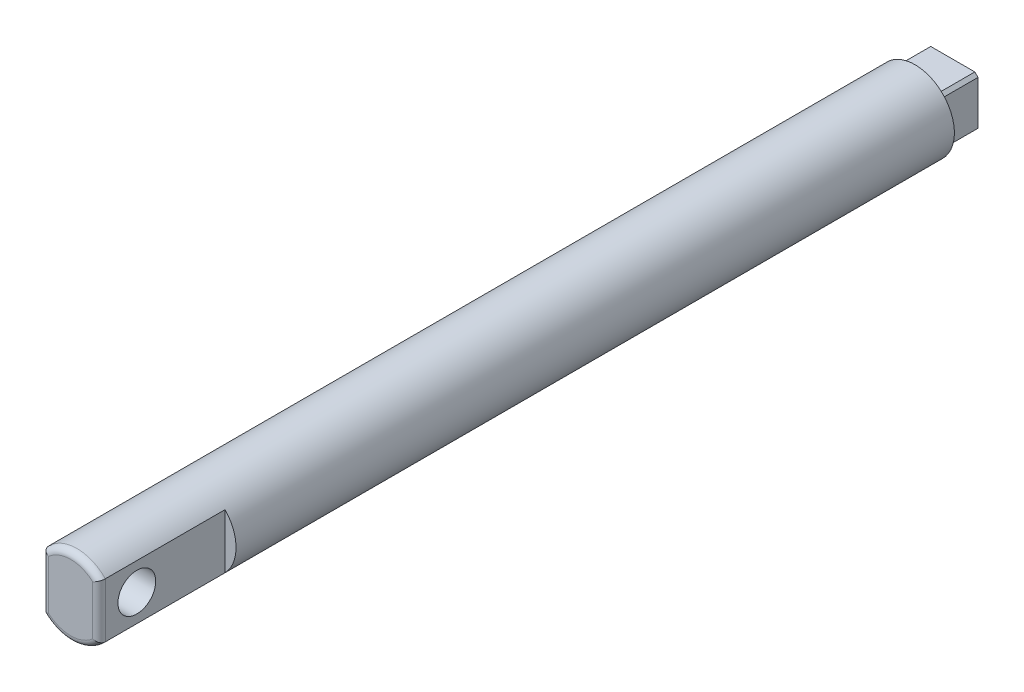
ISO-10303-21;
HEADER;
FILE_DESCRIPTION(('STEP AP214'),'2;1');
FILE_NAME('part.step','',(''),(''),'','','');
FILE_SCHEMA(('AUTOMOTIVE_DESIGN { 1 0 10303 214 1 1 1 1 }'));
ENDSEC;
DATA;
#1=APPLICATION_CONTEXT('core data for automotive mechanical design processes');
#2=APPLICATION_PROTOCOL_DEFINITION('international standard','automotive_design',2000,#1);
#3=PRODUCT_CONTEXT('',#1,'mechanical');
#4=PRODUCT('Part','Part','',(#3));
#5=PRODUCT_RELATED_PRODUCT_CATEGORY('part','',(#4));
#6=PRODUCT_DEFINITION_FORMATION('','',#4);
#7=PRODUCT_DEFINITION_CONTEXT('part definition',#1,'design');
#8=PRODUCT_DEFINITION('design','',#6,#7);
#9=PRODUCT_DEFINITION_SHAPE('','',#8);
#10=(LENGTH_UNIT() NAMED_UNIT(*) SI_UNIT(.MILLI.,.METRE.));
#11=(NAMED_UNIT(*) PLANE_ANGLE_UNIT() SI_UNIT($,.RADIAN.));
#12=(NAMED_UNIT(*) SI_UNIT($,.STERADIAN.) SOLID_ANGLE_UNIT());
#13=UNCERTAINTY_MEASURE_WITH_UNIT(LENGTH_MEASURE(1.E-05),#10,'distance_accuracy_value','');
#14=(GEOMETRIC_REPRESENTATION_CONTEXT(3) GLOBAL_UNCERTAINTY_ASSIGNED_CONTEXT((#13)) GLOBAL_UNIT_ASSIGNED_CONTEXT((#10,
#11,#12)) REPRESENTATION_CONTEXT('',''));
#15=CARTESIAN_POINT('',(0.,0.,0.));
#16=DIRECTION('',(0.,0.,1.));
#17=DIRECTION('',(1.,0.,0.));
#18=AXIS2_PLACEMENT_3D('',#15,#16,#17);
#19=CARTESIAN_POINT('',(0.,0.,280.));
#20=DIRECTION('',(0.,0.,-1.));
#21=DIRECTION('',(-1.,0.,0.));
#22=AXIS2_PLACEMENT_3D('',#19,#20,#21);
#23=CYLINDRICAL_SURFACE('',#22,12.5);
#24=DIRECTION('',(0.,0.,1.));
#25=VECTOR('',#24,1.);
#26=CARTESIAN_POINT('',(9.,-8.67467578644874,240.));
#27=LINE('',#26,#25);
#28=CARTESIAN_POINT('',(9.,-8.67467578644874,240.));
#29=VERTEX_POINT('',#28);
#30=CARTESIAN_POINT('',(9.,-8.67467578644874,278.));
#31=VERTEX_POINT('',#30);
#32=EDGE_CURVE('E191',#29,#31,#27,.T.);
#33=ORIENTED_EDGE('',*,*,#32,.T.);
#34=CARTESIAN_POINT('',(0.,0.,278.));
#35=DIRECTION('',(0.,0.,1.));
#36=DIRECTION('',(1.,0.,0.));
#37=AXIS2_PLACEMENT_3D('',#34,#35,#36);
#38=CIRCLE('',#37,12.5);
#39=CARTESIAN_POINT('',(-9.,-8.67467578644874,278.));
#40=VERTEX_POINT('',#39);
#41=EDGE_CURVE('E223',#31,#40,#38,.F.);
#42=ORIENTED_EDGE('',*,*,#41,.T.);
#43=DIRECTION('',(0.,0.,1.));
#44=VECTOR('',#43,1.);
#45=CARTESIAN_POINT('',(-9.,-8.67467578644874,240.));
#46=LINE('',#45,#44);
#47=CARTESIAN_POINT('',(-9.,-8.67467578644874,240.));
#48=VERTEX_POINT('',#47);
#49=EDGE_CURVE('E202',#48,#40,#46,.T.);
#50=ORIENTED_EDGE('',*,*,#49,.F.);
#51=CARTESIAN_POINT('',(0.,0.,240.));
#52=DIRECTION('',(0.,0.,1.));
#53=DIRECTION('',(1.,0.,0.));
#54=AXIS2_PLACEMENT_3D('',#51,#52,#53);
#55=CIRCLE('',#54,12.5);
#56=CARTESIAN_POINT('',(-9.,8.67467578644874,240.));
#57=VERTEX_POINT('',#56);
#58=EDGE_CURVE('E198',#57,#48,#55,.T.);
#59=ORIENTED_EDGE('',*,*,#58,.F.);
#60=DIRECTION('',(0.,0.,1.));
#61=VECTOR('',#60,1.);
#62=CARTESIAN_POINT('',(-9.,8.67467578644874,240.));
#63=LINE('',#62,#61);
#64=CARTESIAN_POINT('',(-9.,8.67467578644874,278.));
#65=VERTEX_POINT('',#64);
#66=EDGE_CURVE('E201',#57,#65,#63,.T.);
#67=ORIENTED_EDGE('',*,*,#66,.T.);
#68=CARTESIAN_POINT('',(0.,0.,278.));
#69=DIRECTION('',(0.,0.,1.));
#70=DIRECTION('',(1.,0.,0.));
#71=AXIS2_PLACEMENT_3D('',#68,#69,#70);
#72=CIRCLE('',#71,12.5);
#73=CARTESIAN_POINT('',(9.,8.67467578644874,278.));
#74=VERTEX_POINT('',#73);
#75=EDGE_CURVE('E221',#65,#74,#72,.F.);
#76=ORIENTED_EDGE('',*,*,#75,.T.);
#77=DIRECTION('',(0.,0.,1.));
#78=VECTOR('',#77,1.);
#79=CARTESIAN_POINT('',(9.,8.67467578644874,240.));
#80=LINE('',#79,#78);
#81=CARTESIAN_POINT('',(9.,8.67467578644874,240.));
#82=VERTEX_POINT('',#81);
#83=EDGE_CURVE('E190',#82,#74,#80,.T.);
#84=ORIENTED_EDGE('',*,*,#83,.F.);
#85=CARTESIAN_POINT('',(0.,0.,240.));
#86=DIRECTION('',(0.,0.,1.));
#87=DIRECTION('',(1.,0.,0.));
#88=AXIS2_PLACEMENT_3D('',#85,#86,#87);
#89=CIRCLE('',#88,12.5);
#90=EDGE_CURVE('E185',#29,#82,#89,.T.);
#91=ORIENTED_EDGE('',*,*,#90,.F.);
#92=EDGE_LOOP('',(#33,#42,#50,#59,#67,#76,#84,#91));
#93=FACE_BOUND('',#92,.T.);
#94=CARTESIAN_POINT('',(0.,0.,12.));
#95=DIRECTION('',(0.,0.,-1.));
#96=DIRECTION('',(-1.,0.,0.));
#97=AXIS2_PLACEMENT_3D('',#94,#95,#96);
#98=CIRCLE('',#97,12.5);
#99=CARTESIAN_POINT('',(-12.5,0.,12.));
#100=VERTEX_POINT('',#99);
#101=EDGE_CURVE('E159',#100,#100,#98,.T.);
#102=ORIENTED_EDGE('',*,*,#101,.F.);
#103=EDGE_LOOP('',(#102));
#104=FACE_BOUND('',#103,.T.);
#105=ADVANCED_FACE('F38',(#93,#104),#23,.T.);
#106=CARTESIAN_POINT('',(0.,0.,280.));
#107=DIRECTION('',(0.,0.,1.));
#108=DIRECTION('',(1.,0.,0.));
#109=AXIS2_PLACEMENT_3D('',#106,#107,#108);
#110=PLANE('',#109);
#111=CARTESIAN_POINT('',(0.,0.,280.));
#112=DIRECTION('',(0.,0.,1.));
#113=DIRECTION('',(1.,0.,0.));
#114=AXIS2_PLACEMENT_3D('',#111,#112,#113);
#115=CIRCLE('',#114,10.5);
#116=CARTESIAN_POINT('',(-7.,-7.82623792124926,280.));
#117=VERTEX_POINT('',#116);
#118=CARTESIAN_POINT('',(7.,-7.82623792124926,280.));
#119=VERTEX_POINT('',#118);
#120=EDGE_CURVE('E216',#117,#119,#115,.T.);
#121=ORIENTED_EDGE('',*,*,#120,.T.);
#122=DIRECTION('',(0.,-1.,0.));
#123=VECTOR('',#122,1.);
#124=CARTESIAN_POINT('',(7.,8.67467578644874,280.));
#125=LINE('',#124,#123);
#126=CARTESIAN_POINT('',(7.,7.82623792124926,280.));
#127=VERTEX_POINT('',#126);
#128=EDGE_CURVE('E218',#119,#127,#125,.F.);
#129=ORIENTED_EDGE('',*,*,#128,.T.);
#130=CARTESIAN_POINT('',(0.,0.,280.));
#131=DIRECTION('',(0.,0.,1.));
#132=DIRECTION('',(1.,0.,0.));
#133=AXIS2_PLACEMENT_3D('',#130,#131,#132);
#134=CIRCLE('',#133,10.5);
#135=CARTESIAN_POINT('',(-7.,7.82623792124926,280.));
#136=VERTEX_POINT('',#135);
#137=EDGE_CURVE('E212',#127,#136,#134,.T.);
#138=ORIENTED_EDGE('',*,*,#137,.T.);
#139=DIRECTION('',(0.,-1.,0.));
#140=VECTOR('',#139,1.);
#141=CARTESIAN_POINT('',(-7.,0.,280.));
#142=LINE('',#141,#140);
#143=EDGE_CURVE('E214',#136,#117,#142,.T.);
#144=ORIENTED_EDGE('',*,*,#143,.T.);
#145=EDGE_LOOP('',(#121,#129,#138,#144));
#146=FACE_BOUND('',#145,.T.);
#147=ADVANCED_FACE('F337',(#146),#110,.T.);
#148=CARTESIAN_POINT('',(-9.,0.,240.));
#149=DIRECTION('',(-1.,0.,0.));
#150=DIRECTION('',(0.,0.,1.));
#151=AXIS2_PLACEMENT_3D('',#148,#149,#150);
#152=PLANE('',#151);
#153=CARTESIAN_POINT('',(-9.,0.,268.));
#154=DIRECTION('',(-1.,0.,0.));
#155=DIRECTION('',(0.,0.,1.));
#156=AXIS2_PLACEMENT_3D('',#153,#154,#155);
#157=CIRCLE('',#156,5.99999999999999);
#158=CARTESIAN_POINT('',(-9.,0.,274.));
#159=VERTEX_POINT('',#158);
#160=EDGE_CURVE('E180',#159,#159,#157,.T.);
#161=ORIENTED_EDGE('',*,*,#160,.F.);
#162=EDGE_LOOP('',(#161));
#163=FACE_BOUND('',#162,.T.);
#164=ORIENTED_EDGE('',*,*,#49,.T.);
#165=DIRECTION('',(0.,-1.,0.));
#166=VECTOR('',#165,1.);
#167=CARTESIAN_POINT('',(-9.,0.,278.));
#168=LINE('',#167,#166);
#169=EDGE_CURVE('E225',#40,#65,#168,.F.);
#170=ORIENTED_EDGE('',*,*,#169,.T.);
#171=ORIENTED_EDGE('',*,*,#66,.F.);
#172=DIRECTION('',(0.,-1.,0.));
#173=VECTOR('',#172,1.);
#174=CARTESIAN_POINT('',(-9.,0.,240.));
#175=LINE('',#174,#173);
#176=EDGE_CURVE('E194',#57,#48,#175,.T.);
#177=ORIENTED_EDGE('',*,*,#176,.T.);
#178=EDGE_LOOP('',(#164,#170,#171,#177));
#179=FACE_BOUND('',#178,.T.);
#180=ADVANCED_FACE('F342',(#163,#179),#152,.T.);
#181=CARTESIAN_POINT('',(0.,0.,240.));
#182=DIRECTION('',(0.,0.,1.));
#183=DIRECTION('',(1.,0.,0.));
#184=AXIS2_PLACEMENT_3D('',#181,#182,#183);
#185=PLANE('',#184);
#186=ORIENTED_EDGE('',*,*,#176,.F.);
#187=ORIENTED_EDGE('',*,*,#58,.T.);
#188=EDGE_LOOP('',(#186,#187));
#189=FACE_BOUND('',#188,.T.);
#190=ADVANCED_FACE('F352',(#189),#185,.T.);
#191=CARTESIAN_POINT('',(9.,0.,240.));
#192=DIRECTION('',(-1.,0.,0.));
#193=DIRECTION('',(0.,0.,1.));
#194=AXIS2_PLACEMENT_3D('',#191,#192,#193);
#195=PLANE('',#194);
#196=CARTESIAN_POINT('',(9.,0.,268.));
#197=DIRECTION('',(-1.,0.,0.));
#198=DIRECTION('',(0.,0.,1.));
#199=AXIS2_PLACEMENT_3D('',#196,#197,#198);
#200=CIRCLE('',#199,5.99999999999999);
#201=CARTESIAN_POINT('',(9.,0.,274.));
#202=VERTEX_POINT('',#201);
#203=EDGE_CURVE('E183',#202,#202,#200,.T.);
#204=ORIENTED_EDGE('',*,*,#203,.T.);
#205=EDGE_LOOP('',(#204));
#206=FACE_BOUND('',#205,.T.);
#207=ORIENTED_EDGE('',*,*,#83,.T.);
#208=DIRECTION('',(0.,-1.,0.));
#209=VECTOR('',#208,1.);
#210=CARTESIAN_POINT('',(9.,-8.67467578644874,278.));
#211=LINE('',#210,#209);
#212=EDGE_CURVE('E205',#74,#31,#211,.T.);
#213=ORIENTED_EDGE('',*,*,#212,.T.);
#214=ORIENTED_EDGE('',*,*,#32,.F.);
#215=DIRECTION('',(0.,-1.,0.));
#216=VECTOR('',#215,1.);
#217=CARTESIAN_POINT('',(9.,0.,240.));
#218=LINE('',#217,#216);
#219=EDGE_CURVE('E187',#82,#29,#218,.T.);
#220=ORIENTED_EDGE('',*,*,#219,.F.);
#221=EDGE_LOOP('',(#207,#213,#214,#220));
#222=FACE_BOUND('',#221,.T.);
#223=ADVANCED_FACE('F356',(#206,#222),#195,.F.);
#224=CARTESIAN_POINT('',(0.,0.,240.));
#225=DIRECTION('',(0.,0.,1.));
#226=DIRECTION('',(1.,0.,0.));
#227=AXIS2_PLACEMENT_3D('',#224,#225,#226);
#228=PLANE('',#227);
#229=ORIENTED_EDGE('',*,*,#90,.T.);
#230=ORIENTED_EDGE('',*,*,#219,.T.);
#231=EDGE_LOOP('',(#229,#230));
#232=FACE_BOUND('',#231,.T.);
#233=ADVANCED_FACE('F360',(#232),#228,.T.);
#234=CARTESIAN_POINT('',(12.5,0.,268.));
#235=DIRECTION('',(-1.,0.,0.));
#236=DIRECTION('',(0.,0.,1.));
#237=AXIS2_PLACEMENT_3D('',#234,#235,#236);
#238=CYLINDRICAL_SURFACE('',#237,5.99999999999999);
#239=ORIENTED_EDGE('',*,*,#160,.T.);
#240=EDGE_LOOP('',(#239));
#241=FACE_BOUND('',#240,.T.);
#242=ORIENTED_EDGE('',*,*,#203,.F.);
#243=EDGE_LOOP('',(#242));
#244=FACE_BOUND('',#243,.T.);
#245=ADVANCED_FACE('F364',(#241,#244),#238,.F.);
#246=CARTESIAN_POINT('',(-7.,0.,278.));
#247=DIRECTION('',(0.,-1.,0.));
#248=DIRECTION('',(0.,0.,-1.));
#249=AXIS2_PLACEMENT_3D('',#246,#247,#248);
#250=CYLINDRICAL_SURFACE('',#249,2.);
#251=CARTESIAN_POINT('',(-9.,-8.67467578644874,278.));
#252=CARTESIAN_POINT('',(-9.0000073167469,-8.6746782079919,278.053234068983));
#253=CARTESIAN_POINT('',(-8.99787473684516,-8.67381828596127,278.106464422485));
#254=CARTESIAN_POINT('',(-8.98938590051363,-8.67039253276233,278.21252243093));
#255=CARTESIAN_POINT('',(-8.9830304257429,-8.66782701729982,278.265350158571));
#256=CARTESIAN_POINT('',(-8.96617347023784,-8.6610175646934,278.370093468376));
#257=CARTESIAN_POINT('',(-8.95568263881077,-8.65677793864517,278.422011038481));
#258=CARTESIAN_POINT('',(-8.93067276302031,-8.64666032159602,278.524689384449));
#259=CARTESIAN_POINT('',(-8.91615366227876,-8.64078230766482,278.57545014411));
#260=CARTESIAN_POINT('',(-8.86675593811283,-8.62075822466612,278.725446701077));
#261=CARTESIAN_POINT('',(-8.82601803511523,-8.60421453568919,278.822512220072));
#262=CARTESIAN_POINT('',(-8.7304943609777,-8.56526925405721,279.008121438718));
#263=CARTESIAN_POINT('',(-8.67570418240066,-8.54286582347512,279.096662452688));
#264=CARTESIAN_POINT('',(-8.55223582951307,-8.4921322857085,279.265626977039));
#265=CARTESIAN_POINT('',(-8.48320945607708,-8.46365280664359,279.345751005818));
#266=CARTESIAN_POINT('',(-8.33454728946146,-8.4019510792965,279.49330639572));
#267=CARTESIAN_POINT('',(-8.25490836631737,-8.36872743160668,279.560733998067));
#268=CARTESIAN_POINT('',(-8.08156574263489,-8.29592507387902,279.685947239944));
#269=CARTESIAN_POINT('',(-7.98727153198775,-8.25606650128821,279.742751445474));
#270=CARTESIAN_POINT('',(-7.79191846580725,-8.17283060006621,279.839773216697));
#271=CARTESIAN_POINT('',(-7.69085671548275,-8.12945176395215,279.879983631097));
#272=CARTESIAN_POINT('',(-7.49347395122764,-8.04400313509261,279.940676484053));
#273=CARTESIAN_POINT('',(-7.39748532295986,-8.00213800898434,279.962550620781));
#274=CARTESIAN_POINT('',(-7.20407170482279,-7.91708930922928,279.991956836363));
#275=CARTESIAN_POINT('',(-7.10664997241938,-7.87390854058144,279.999517518008));
#276=CARTESIAN_POINT('',(-7.00630497441252,-7.82905721332727,279.999992563234));
#277=CARTESIAN_POINT('',(-7.00315234862438,-7.82764769731309,280.000000017197));
#278=CARTESIAN_POINT('',(-7.,-7.82623792124926,280.));
#279=B_SPLINE_CURVE_WITH_KNOTS('',3,(#251,#252,#253,#254,#255,#256,#257,#258,#259,#260,#261,
#262,#263,#264,#265,#266,#267,#268,#269,#270,#271,#272,#273,#274,#275,#276,#277,#278),
.UNSPECIFIED.,.F.,.F.,(4,2,2,2,2,2,2,2,2,2,2,2,2,4),(0.,0.159646183574104,0.319262824822402,
0.478471081218599,0.637681565946164,0.955755325103231,1.27392896901816,1.60107891072101,
1.92832555334863,2.2780677774421,2.62796057011931,2.94796734802698,3.2673339738276,
3.27769407827221),.UNSPECIFIED.);
#280=EDGE_CURVE('E264',#117,#40,#279,.F.);
#281=ORIENTED_EDGE('',*,*,#280,.F.);
#282=ORIENTED_EDGE('',*,*,#143,.F.);
#283=CARTESIAN_POINT('',(-9.,8.67467578644874,278.));
#284=CARTESIAN_POINT('',(-9.0000073167469,8.6746782079919,278.053234068983));
#285=CARTESIAN_POINT('',(-8.99787473684516,8.67381828596127,278.106464422485));
#286=CARTESIAN_POINT('',(-8.98938590051363,8.67039253276233,278.21252243093));
#287=CARTESIAN_POINT('',(-8.9830304257429,8.66782701729982,278.265350158571));
#288=CARTESIAN_POINT('',(-8.96617347023784,8.6610175646934,278.370093468376));
#289=CARTESIAN_POINT('',(-8.95568263881077,8.65677793864517,278.422011038481));
#290=CARTESIAN_POINT('',(-8.93067276302031,8.64666032159602,278.524689384449));
#291=CARTESIAN_POINT('',(-8.91615366227876,8.64078230766482,278.57545014411));
#292=CARTESIAN_POINT('',(-8.86675593811283,8.62075822466612,278.725446701077));
#293=CARTESIAN_POINT('',(-8.82601803511523,8.60421453568919,278.822512220072));
#294=CARTESIAN_POINT('',(-8.7304943609777,8.56526925405721,279.008121438718));
#295=CARTESIAN_POINT('',(-8.67570418240066,8.54286582347512,279.096662452688));
#296=CARTESIAN_POINT('',(-8.55223582951307,8.4921322857085,279.265626977039));
#297=CARTESIAN_POINT('',(-8.48320945607708,8.46365280664359,279.345751005818));
#298=CARTESIAN_POINT('',(-8.33454728946146,8.4019510792965,279.49330639572));
#299=CARTESIAN_POINT('',(-8.25490836631737,8.36872743160668,279.560733998067));
#300=CARTESIAN_POINT('',(-8.08156574263489,8.29592507387902,279.685947239944));
#301=CARTESIAN_POINT('',(-7.98727153198775,8.25606650128821,279.742751445474));
#302=CARTESIAN_POINT('',(-7.79191846580725,8.17283060006621,279.839773216697));
#303=CARTESIAN_POINT('',(-7.69085671548275,8.12945176395215,279.879983631097));
#304=CARTESIAN_POINT('',(-7.49347395122764,8.04400313509261,279.940676484053));
#305=CARTESIAN_POINT('',(-7.39748532295986,8.00213800898434,279.962550620781));
#306=CARTESIAN_POINT('',(-7.20407170482279,7.91708930922928,279.991956836363));
#307=CARTESIAN_POINT('',(-7.10664997241938,7.87390854058144,279.999517518008));
#308=CARTESIAN_POINT('',(-7.00630497441252,7.82905721332727,279.999992563234));
#309=CARTESIAN_POINT('',(-7.00315234862438,7.82764769731309,280.000000017197));
#310=CARTESIAN_POINT('',(-7.,7.82623792124926,280.));
#311=B_SPLINE_CURVE_WITH_KNOTS('',3,(#283,#284,#285,#286,#287,#288,#289,#290,#291,#292,#293,
#294,#295,#296,#297,#298,#299,#300,#301,#302,#303,#304,#305,#306,#307,#308,#309,#310),
.UNSPECIFIED.,.F.,.F.,(4,2,2,2,2,2,2,2,2,2,2,2,2,4),(0.,0.159646183574104,0.319262824822402,
0.478471081218599,0.637681565946164,0.955755325103231,1.27392896901816,1.60107891072101,
1.92832555334863,2.2780677774421,2.62796057011931,2.94796734802698,3.2673339738276,
3.27769407827221),.UNSPECIFIED.);
#312=EDGE_CURVE('E184',#65,#136,#311,.T.);
#313=ORIENTED_EDGE('',*,*,#312,.F.);
#314=ORIENTED_EDGE('',*,*,#169,.F.);
#315=EDGE_LOOP('',(#281,#282,#313,#314));
#316=FACE_BOUND('',#315,.T.);
#317=ADVANCED_FACE('F253',(#316),#250,.T.);
#318=CARTESIAN_POINT('',(0.,0.,278.));
#319=DIRECTION('',(0.,0.,1.));
#320=DIRECTION('',(1.,0.,0.));
#321=AXIS2_PLACEMENT_3D('',#318,#319,#320);
#322=TOROIDAL_SURFACE('',#321,10.5,2.);
#323=ORIENTED_EDGE('',*,*,#312,.T.);
#324=ORIENTED_EDGE('',*,*,#137,.F.);
#325=CARTESIAN_POINT('',(9.,8.67467578644874,278.));
#326=CARTESIAN_POINT('',(9.0000073167469,8.6746782079919,278.053234068983));
#327=CARTESIAN_POINT('',(8.99787473684516,8.67381828596127,278.106464422485));
#328=CARTESIAN_POINT('',(8.98938590051363,8.67039253276233,278.212522430931));
#329=CARTESIAN_POINT('',(8.9830304257429,8.66782701729981,278.265350158571));
#330=CARTESIAN_POINT('',(8.96617347023783,8.66101756469339,278.370093468376));
#331=CARTESIAN_POINT('',(8.95568263881077,8.65677793864517,278.422011038481));
#332=CARTESIAN_POINT('',(8.93067276302031,8.64666032159602,278.524689384449));
#333=CARTESIAN_POINT('',(8.91615366227876,8.64078230766482,278.57545014411));
#334=CARTESIAN_POINT('',(8.86675593811283,8.62075822466612,278.725446701077));
#335=CARTESIAN_POINT('',(8.82601803511523,8.60421453568919,278.822512220072));
#336=CARTESIAN_POINT('',(8.7304943609777,8.56526925405721,279.008121438718));
#337=CARTESIAN_POINT('',(8.67570418240066,8.54286582347511,279.096662452688));
#338=CARTESIAN_POINT('',(8.55223582951307,8.4921322857085,279.265626977039));
#339=CARTESIAN_POINT('',(8.48320945607708,8.46365280664358,279.345751005818));
#340=CARTESIAN_POINT('',(8.33454728946146,8.40195107929649,279.49330639572));
#341=CARTESIAN_POINT('',(8.25490836631737,8.36872743160667,279.560733998067));
#342=CARTESIAN_POINT('',(8.08156574263489,8.29592507387902,279.685947239944));
#343=CARTESIAN_POINT('',(7.98727153198775,8.25606650128821,279.742751445474));
#344=CARTESIAN_POINT('',(7.79191846580725,8.17283060006621,279.839773216697));
#345=CARTESIAN_POINT('',(7.69085671548276,8.12945176395215,279.879983631097));
#346=CARTESIAN_POINT('',(7.49347395122764,8.04400313509261,279.940676484053));
#347=CARTESIAN_POINT('',(7.39748532295985,8.00213800898434,279.962550620781));
#348=CARTESIAN_POINT('',(7.2040717048228,7.91708930922927,279.991956836363));
#349=CARTESIAN_POINT('',(7.1066499724194,7.8739085405814,279.999517518008));
#350=CARTESIAN_POINT('',(7.00630497441252,7.82905721332727,279.999992563234));
#351=CARTESIAN_POINT('',(7.00315234862438,7.82764769731309,280.000000017197));
#352=CARTESIAN_POINT('',(7.,7.82623792124926,280.));
#353=B_SPLINE_CURVE_WITH_KNOTS('',3,(#325,#326,#327,#328,#329,#330,#331,#332,#333,#334,#335,
#336,#337,#338,#339,#340,#341,#342,#343,#344,#345,#346,#347,#348,#349,#350,#351,#352),
.UNSPECIFIED.,.F.,.F.,(4,2,2,2,2,2,2,2,2,2,2,2,2,4),(0.,0.15964618357416,0.319262824822458,
0.478471081218599,0.637681565946164,0.955755325103231,1.27392896901816,1.60107891072101,
1.92832555334863,2.2780677774421,2.62796057011931,2.94796734802698,3.2673339738276,
3.27769407827221),.UNSPECIFIED.);
#354=EDGE_CURVE('E234',#74,#127,#353,.T.);
#355=ORIENTED_EDGE('',*,*,#354,.F.);
#356=ORIENTED_EDGE('',*,*,#75,.F.);
#357=EDGE_LOOP('',(#323,#324,#355,#356));
#358=FACE_BOUND('',#357,.T.);
#359=ADVANCED_FACE('F248',(#358),#322,.T.);
#360=CARTESIAN_POINT('',(0.,0.,278.));
#361=DIRECTION('',(0.,0.,1.));
#362=DIRECTION('',(1.,0.,0.));
#363=AXIS2_PLACEMENT_3D('',#360,#361,#362);
#364=TOROIDAL_SURFACE('',#363,10.5,2.);
#365=ORIENTED_EDGE('',*,*,#280,.T.);
#366=ORIENTED_EDGE('',*,*,#41,.F.);
#367=CARTESIAN_POINT('',(9.,-8.67467578644874,278.));
#368=CARTESIAN_POINT('',(9.0000073167469,-8.6746782079919,278.053234068983));
#369=CARTESIAN_POINT('',(8.99787473684516,-8.67381828596127,278.106464422485));
#370=CARTESIAN_POINT('',(8.98938590051363,-8.67039253276233,278.212522430931));
#371=CARTESIAN_POINT('',(8.9830304257429,-8.66782701729981,278.265350158571));
#372=CARTESIAN_POINT('',(8.96617347023783,-8.66101756469339,278.370093468376));
#373=CARTESIAN_POINT('',(8.95568263881077,-8.65677793864517,278.422011038481));
#374=CARTESIAN_POINT('',(8.93067276302031,-8.64666032159602,278.524689384449));
#375=CARTESIAN_POINT('',(8.91615366227876,-8.64078230766482,278.57545014411));
#376=CARTESIAN_POINT('',(8.86675593811283,-8.62075822466612,278.725446701077));
#377=CARTESIAN_POINT('',(8.82601803511523,-8.60421453568919,278.822512220072));
#378=CARTESIAN_POINT('',(8.7304943609777,-8.56526925405721,279.008121438718));
#379=CARTESIAN_POINT('',(8.67570418240066,-8.54286582347511,279.096662452688));
#380=CARTESIAN_POINT('',(8.55223582951307,-8.4921322857085,279.265626977039));
#381=CARTESIAN_POINT('',(8.48320945607708,-8.46365280664358,279.345751005818));
#382=CARTESIAN_POINT('',(8.33454728946146,-8.40195107929649,279.49330639572));
#383=CARTESIAN_POINT('',(8.25490836631737,-8.36872743160667,279.560733998067));
#384=CARTESIAN_POINT('',(8.08156574263489,-8.29592507387902,279.685947239944));
#385=CARTESIAN_POINT('',(7.98727153198775,-8.25606650128821,279.742751445474));
#386=CARTESIAN_POINT('',(7.79191846580725,-8.17283060006621,279.839773216697));
#387=CARTESIAN_POINT('',(7.69085671548276,-8.12945176395215,279.879983631097));
#388=CARTESIAN_POINT('',(7.49347395122764,-8.04400313509261,279.940676484053));
#389=CARTESIAN_POINT('',(7.39748532295985,-8.00213800898434,279.962550620781));
#390=CARTESIAN_POINT('',(7.2040717048228,-7.91708930922927,279.991956836363));
#391=CARTESIAN_POINT('',(7.1066499724194,-7.8739085405814,279.999517518008));
#392=CARTESIAN_POINT('',(7.00630497441252,-7.82905721332727,279.999992563234));
#393=CARTESIAN_POINT('',(7.00315234862438,-7.82764769731309,280.000000017197));
#394=CARTESIAN_POINT('',(7.,-7.82623792124926,280.));
#395=B_SPLINE_CURVE_WITH_KNOTS('',3,(#367,#368,#369,#370,#371,#372,#373,#374,#375,#376,#377,
#378,#379,#380,#381,#382,#383,#384,#385,#386,#387,#388,#389,#390,#391,#392,#393,#394),
.UNSPECIFIED.,.F.,.F.,(4,2,2,2,2,2,2,2,2,2,2,2,2,4),(0.,0.15964618357416,0.319262824822458,
0.478471081218599,0.637681565946164,0.955755325103231,1.27392896901816,1.60107891072101,
1.92832555334863,2.2780677774421,2.62796057011931,2.94796734802698,3.2673339738276,
3.27769407827221),.UNSPECIFIED.);
#396=EDGE_CURVE('E172',#119,#31,#395,.F.);
#397=ORIENTED_EDGE('',*,*,#396,.F.);
#398=ORIENTED_EDGE('',*,*,#120,.F.);
#399=EDGE_LOOP('',(#365,#366,#397,#398));
#400=FACE_BOUND('',#399,.T.);
#401=ADVANCED_FACE('F240',(#400),#364,.T.);
#402=CARTESIAN_POINT('',(7.,0.,278.));
#403=DIRECTION('',(0.,1.,0.));
#404=DIRECTION('',(0.,0.,1.));
#405=AXIS2_PLACEMENT_3D('',#402,#403,#404);
#406=CYLINDRICAL_SURFACE('',#405,2.);
#407=ORIENTED_EDGE('',*,*,#354,.T.);
#408=ORIENTED_EDGE('',*,*,#128,.F.);
#409=ORIENTED_EDGE('',*,*,#396,.T.);
#410=ORIENTED_EDGE('',*,*,#212,.F.);
#411=EDGE_LOOP('',(#407,#408,#409,#410));
#412=FACE_BOUND('',#411,.T.);
#413=ADVANCED_FACE('F243',(#412),#406,.T.);
#414=CARTESIAN_POINT('',(0.,-8.,12.));
#415=DIRECTION('',(0.,1.,0.));
#416=DIRECTION('',(-1.,0.,0.));
#417=AXIS2_PLACEMENT_3D('',#414,#415,#416);
#418=PLANE('',#417);
#419=DIRECTION('',(1.,0.,0.));
#420=VECTOR('',#419,1.);
#421=CARTESIAN_POINT('',(0.,-8.,12.));
#422=LINE('',#421,#420);
#423=CARTESIAN_POINT('',(-7.00000000000002,-8.,12.));
#424=VERTEX_POINT('',#423);
#425=CARTESIAN_POINT('',(7.00000000000003,-8.,12.));
#426=VERTEX_POINT('',#425);
#427=EDGE_CURVE('E162',#424,#426,#422,.T.);
#428=ORIENTED_EDGE('',*,*,#427,.F.);
#429=DIRECTION('',(0.,0.,-1.));
#430=VECTOR('',#429,1.);
#431=CARTESIAN_POINT('',(-7.00000000000002,-8.,0.));
#432=LINE('',#431,#430);
#433=CARTESIAN_POINT('',(-7.00000000000002,-8.,0.));
#434=VERTEX_POINT('',#433);
#435=EDGE_CURVE('E269',#424,#434,#432,.T.);
#436=ORIENTED_EDGE('',*,*,#435,.T.);
#437=DIRECTION('',(1.,0.,0.));
#438=VECTOR('',#437,1.);
#439=CARTESIAN_POINT('',(0.,-8.,0.));
#440=LINE('',#439,#438);
#441=CARTESIAN_POINT('',(7.00000000000003,-8.,0.));
#442=VERTEX_POINT('',#441);
#443=EDGE_CURVE('E150',#434,#442,#440,.T.);
#444=ORIENTED_EDGE('',*,*,#443,.T.);
#445=DIRECTION('',(0.,0.,1.));
#446=VECTOR('',#445,1.);
#447=CARTESIAN_POINT('',(7.00000000000003,-8.,12.));
#448=LINE('',#447,#446);
#449=EDGE_CURVE('E227',#442,#426,#448,.T.);
#450=ORIENTED_EDGE('',*,*,#449,.T.);
#451=EDGE_LOOP('',(#428,#436,#444,#450));
#452=FACE_BOUND('',#451,.T.);
#453=ADVANCED_FACE('F246',(#452),#418,.F.);
#454=CARTESIAN_POINT('',(-8.,0.,12.));
#455=DIRECTION('',(-1.,0.,0.));
#456=DIRECTION('',(0.,0.,1.));
#457=AXIS2_PLACEMENT_3D('',#454,#455,#456);
#458=PLANE('',#457);
#459=DIRECTION('',(0.,1.,0.));
#460=VECTOR('',#459,1.);
#461=CARTESIAN_POINT('',(-8.,0.,0.));
#462=LINE('',#461,#460);
#463=CARTESIAN_POINT('',(-8.,-7.00000000000006,0.));
#464=VERTEX_POINT('',#463);
#465=CARTESIAN_POINT('',(-8.,7.00000000000005,0.));
#466=VERTEX_POINT('',#465);
#467=EDGE_CURVE('E163',#464,#466,#462,.T.);
#468=ORIENTED_EDGE('',*,*,#467,.F.);
#469=DIRECTION('',(0.,0.,1.));
#470=VECTOR('',#469,1.);
#471=CARTESIAN_POINT('',(-8.,-7.00000000000006,12.));
#472=LINE('',#471,#470);
#473=CARTESIAN_POINT('',(-8.,-7.00000000000006,12.));
#474=VERTEX_POINT('',#473);
#475=EDGE_CURVE('E283',#464,#474,#472,.T.);
#476=ORIENTED_EDGE('',*,*,#475,.T.);
#477=DIRECTION('',(0.,1.,0.));
#478=VECTOR('',#477,1.);
#479=CARTESIAN_POINT('',(-8.,0.,12.));
#480=LINE('',#479,#478);
#481=CARTESIAN_POINT('',(-8.,7.00000000000006,12.));
#482=VERTEX_POINT('',#481);
#483=EDGE_CURVE('E170',#474,#482,#480,.T.);
#484=ORIENTED_EDGE('',*,*,#483,.T.);
#485=DIRECTION('',(0.,0.,-1.));
#486=VECTOR('',#485,1.);
#487=CARTESIAN_POINT('',(-8.,7.00000000000006,12.));
#488=LINE('',#487,#486);
#489=EDGE_CURVE('E280',#482,#466,#488,.T.);
#490=ORIENTED_EDGE('',*,*,#489,.T.);
#491=EDGE_LOOP('',(#468,#476,#484,#490));
#492=FACE_BOUND('',#491,.T.);
#493=ADVANCED_FACE('F307',(#492),#458,.T.);
#494=CARTESIAN_POINT('',(0.,8.,12.));
#495=DIRECTION('',(0.,1.,0.));
#496=DIRECTION('',(-1.,0.,0.));
#497=AXIS2_PLACEMENT_3D('',#494,#495,#496);
#498=PLANE('',#497);
#499=DIRECTION('',(1.,0.,0.));
#500=VECTOR('',#499,1.);
#501=CARTESIAN_POINT('',(0.,8.,0.));
#502=LINE('',#501,#500);
#503=CARTESIAN_POINT('',(-7.00000000000002,8.,0.));
#504=VERTEX_POINT('',#503);
#505=CARTESIAN_POINT('',(7.00000000000002,8.,0.));
#506=VERTEX_POINT('',#505);
#507=EDGE_CURVE('E175',#504,#506,#502,.T.);
#508=ORIENTED_EDGE('',*,*,#507,.F.);
#509=DIRECTION('',(0.,0.,1.));
#510=VECTOR('',#509,1.);
#511=CARTESIAN_POINT('',(-7.00000000000002,8.,12.));
#512=LINE('',#511,#510);
#513=CARTESIAN_POINT('',(-7.00000000000002,8.,12.));
#514=VERTEX_POINT('',#513);
#515=EDGE_CURVE('E288',#504,#514,#512,.T.);
#516=ORIENTED_EDGE('',*,*,#515,.T.);
#517=DIRECTION('',(1.,0.,0.));
#518=VECTOR('',#517,1.);
#519=CARTESIAN_POINT('',(0.,8.,12.));
#520=LINE('',#519,#518);
#521=CARTESIAN_POINT('',(7.00000000000003,8.,12.));
#522=VERTEX_POINT('',#521);
#523=EDGE_CURVE('E167',#514,#522,#520,.T.);
#524=ORIENTED_EDGE('',*,*,#523,.T.);
#525=DIRECTION('',(0.,0.,-1.));
#526=VECTOR('',#525,1.);
#527=CARTESIAN_POINT('',(7.00000000000003,8.,0.));
#528=LINE('',#527,#526);
#529=EDGE_CURVE('E285',#522,#506,#528,.T.);
#530=ORIENTED_EDGE('',*,*,#529,.T.);
#531=EDGE_LOOP('',(#508,#516,#524,#530));
#532=FACE_BOUND('',#531,.T.);
#533=ADVANCED_FACE('F314',(#532),#498,.T.);
#534=CARTESIAN_POINT('',(8.,0.,12.));
#535=DIRECTION('',(-1.,0.,0.));
#536=DIRECTION('',(0.,0.,1.));
#537=AXIS2_PLACEMENT_3D('',#534,#535,#536);
#538=PLANE('',#537);
#539=DIRECTION('',(0.,1.,0.));
#540=VECTOR('',#539,1.);
#541=CARTESIAN_POINT('',(8.,0.,12.));
#542=LINE('',#541,#540);
#543=CARTESIAN_POINT('',(8.,-7.00000000000006,12.));
#544=VERTEX_POINT('',#543);
#545=CARTESIAN_POINT('',(8.,7.00000000000005,12.));
#546=VERTEX_POINT('',#545);
#547=EDGE_CURVE('E165',#544,#546,#542,.T.);
#548=ORIENTED_EDGE('',*,*,#547,.F.);
#549=DIRECTION('',(0.,0.,-1.));
#550=VECTOR('',#549,1.);
#551=CARTESIAN_POINT('',(8.,-7.00000000000006,12.));
#552=LINE('',#551,#550);
#553=CARTESIAN_POINT('',(8.,-7.00000000000006,0.));
#554=VERTEX_POINT('',#553);
#555=EDGE_CURVE('E291',#544,#554,#552,.T.);
#556=ORIENTED_EDGE('',*,*,#555,.T.);
#557=DIRECTION('',(0.,1.,0.));
#558=VECTOR('',#557,1.);
#559=CARTESIAN_POINT('',(8.,0.,0.));
#560=LINE('',#559,#558);
#561=CARTESIAN_POINT('',(8.,7.00000000000005,0.));
#562=VERTEX_POINT('',#561);
#563=EDGE_CURVE('E154',#554,#562,#560,.T.);
#564=ORIENTED_EDGE('',*,*,#563,.T.);
#565=DIRECTION('',(0.,0.,1.));
#566=VECTOR('',#565,1.);
#567=CARTESIAN_POINT('',(8.,7.00000000000005,12.));
#568=LINE('',#567,#566);
#569=EDGE_CURVE('E53',#562,#546,#568,.T.);
#570=ORIENTED_EDGE('',*,*,#569,.T.);
#571=EDGE_LOOP('',(#548,#556,#564,#570));
#572=FACE_BOUND('',#571,.T.);
#573=ADVANCED_FACE('F319',(#572),#538,.F.);
#574=CARTESIAN_POINT('',(0.,0.,12.));
#575=DIRECTION('',(0.,0.,-1.));
#576=DIRECTION('',(-1.,0.,0.));
#577=AXIS2_PLACEMENT_3D('',#574,#575,#576);
#578=PLANE('',#577);
#579=ORIENTED_EDGE('',*,*,#101,.T.);
#580=EDGE_LOOP('',(#579));
#581=FACE_BOUND('',#580,.T.);
#582=ORIENTED_EDGE('',*,*,#483,.F.);
#583=DIRECTION('',(0.707106781186557,-0.707106781186538,0.));
#584=VECTOR('',#583,1.);
#585=CARTESIAN_POINT('',(-7.00000000000002,-8.,12.));
#586=LINE('',#585,#584);
#587=EDGE_CURVE('E294',#474,#424,#586,.T.);
#588=ORIENTED_EDGE('',*,*,#587,.T.);
#589=ORIENTED_EDGE('',*,*,#427,.T.);
#590=DIRECTION('',(-0.707106781186557,-0.707106781186538,0.));
#591=VECTOR('',#590,1.);
#592=CARTESIAN_POINT('',(8.,-7.00000000000006,12.));
#593=LINE('',#592,#591);
#594=EDGE_CURVE('E46',#426,#544,#593,.F.);
#595=ORIENTED_EDGE('',*,*,#594,.T.);
#596=ORIENTED_EDGE('',*,*,#547,.T.);
#597=DIRECTION('',(-0.707106781186557,0.707106781186538,0.));
#598=VECTOR('',#597,1.);
#599=CARTESIAN_POINT('',(7.00000000000003,8.,12.));
#600=LINE('',#599,#598);
#601=EDGE_CURVE('E11',#546,#522,#600,.T.);
#602=ORIENTED_EDGE('',*,*,#601,.T.);
#603=ORIENTED_EDGE('',*,*,#523,.F.);
#604=DIRECTION('',(0.707106781186557,0.707106781186538,0.));
#605=VECTOR('',#604,1.);
#606=CARTESIAN_POINT('',(-8.,7.00000000000006,12.));
#607=LINE('',#606,#605);
#608=EDGE_CURVE('E296',#514,#482,#607,.F.);
#609=ORIENTED_EDGE('',*,*,#608,.T.);
#610=EDGE_LOOP('',(#582,#588,#589,#595,#596,#602,#603,#609));
#611=FACE_BOUND('',#610,.T.);
#612=ADVANCED_FACE('F300',(#581,#611),#578,.T.);
#613=CARTESIAN_POINT('',(0.,0.,0.));
#614=DIRECTION('',(0.,0.,1.));
#615=DIRECTION('',(1.,0.,0.));
#616=AXIS2_PLACEMENT_3D('',#613,#614,#615);
#617=PLANE('',#616);
#618=CARTESIAN_POINT('',(0.,0.,0.));
#619=DIRECTION('',(0.,0.,-1.));
#620=DIRECTION('',(-1.,0.,0.));
#621=AXIS2_PLACEMENT_3D('',#618,#619,#620);
#622=CIRCLE('',#621,2.5);
#623=CARTESIAN_POINT('',(-2.5,0.,0.));
#624=VERTEX_POINT('',#623);
#625=EDGE_CURVE('E151',#624,#624,#622,.T.);
#626=ORIENTED_EDGE('',*,*,#625,.F.);
#627=EDGE_LOOP('',(#626));
#628=FACE_BOUND('',#627,.T.);
#629=ORIENTED_EDGE('',*,*,#443,.F.);
#630=DIRECTION('',(-0.707106781186557,0.707106781186538,0.));
#631=VECTOR('',#630,1.);
#632=CARTESIAN_POINT('',(-7.00000000000002,-8.,0.));
#633=LINE('',#632,#631);
#634=EDGE_CURVE('E278',#434,#464,#633,.T.);
#635=ORIENTED_EDGE('',*,*,#634,.T.);
#636=ORIENTED_EDGE('',*,*,#467,.T.);
#637=DIRECTION('',(-0.707106781186557,-0.707106781186538,0.));
#638=VECTOR('',#637,1.);
#639=CARTESIAN_POINT('',(-8.,7.00000000000006,0.));
#640=LINE('',#639,#638);
#641=EDGE_CURVE('E276',#466,#504,#640,.F.);
#642=ORIENTED_EDGE('',*,*,#641,.T.);
#643=ORIENTED_EDGE('',*,*,#507,.T.);
#644=DIRECTION('',(0.707106781186557,-0.707106781186538,0.));
#645=VECTOR('',#644,1.);
#646=CARTESIAN_POINT('',(7.00000000000003,8.,0.));
#647=LINE('',#646,#645);
#648=EDGE_CURVE('E272',#506,#562,#647,.T.);
#649=ORIENTED_EDGE('',*,*,#648,.T.);
#650=ORIENTED_EDGE('',*,*,#563,.F.);
#651=DIRECTION('',(0.707106781186557,0.707106781186538,0.));
#652=VECTOR('',#651,1.);
#653=CARTESIAN_POINT('',(8.,-7.00000000000006,0.));
#654=LINE('',#653,#652);
#655=EDGE_CURVE('E274',#554,#442,#654,.F.);
#656=ORIENTED_EDGE('',*,*,#655,.T.);
#657=EDGE_LOOP('',(#629,#635,#636,#642,#643,#649,#650,#656));
#658=FACE_BOUND('',#657,.T.);
#659=ADVANCED_FACE('F144',(#628,#658),#617,.F.);
#660=CARTESIAN_POINT('',(0.,0.,15.));
#661=DIRECTION('',(0.,0.,-1.));
#662=DIRECTION('',(-1.,0.,0.));
#663=AXIS2_PLACEMENT_3D('',#660,#661,#662);
#664=CONICAL_SURFACE('',#663,2.5,1.02974425867665);
#665=CARTESIAN_POINT('',(0.,0.,16.5021515475689));
#666=VERTEX_POINT('',#665);
#667=VERTEX_LOOP('',#666);
#668=FACE_BOUND('',#667,.T.);
#669=CARTESIAN_POINT('',(0.,0.,15.));
#670=DIRECTION('',(0.,0.,-1.));
#671=DIRECTION('',(-1.,0.,0.));
#672=AXIS2_PLACEMENT_3D('',#669,#670,#671);
#673=CIRCLE('',#672,2.5);
#674=CARTESIAN_POINT('',(-2.5,0.,15.));
#675=VERTEX_POINT('',#674);
#676=EDGE_CURVE('E148',#675,#675,#673,.T.);
#677=ORIENTED_EDGE('',*,*,#676,.T.);
#678=EDGE_LOOP('',(#677));
#679=FACE_BOUND('',#678,.T.);
#680=ADVANCED_FACE('F140',(#668,#679),#664,.F.);
#681=CARTESIAN_POINT('',(0.,0.,0.));
#682=DIRECTION('',(0.,0.,-1.));
#683=DIRECTION('',(-1.,0.,0.));
#684=AXIS2_PLACEMENT_3D('',#681,#682,#683);
#685=CYLINDRICAL_SURFACE('',#684,2.5);
#686=ORIENTED_EDGE('',*,*,#676,.F.);
#687=EDGE_LOOP('',(#686));
#688=FACE_BOUND('',#687,.T.);
#689=ORIENTED_EDGE('',*,*,#625,.T.);
#690=EDGE_LOOP('',(#689));
#691=FACE_BOUND('',#690,.T.);
#692=ADVANCED_FACE('F143',(#688,#691),#685,.F.);
#693=CARTESIAN_POINT('',(-7.00000000000002,-8.,12.));
#694=DIRECTION('',(-0.707106781186538,-0.707106781186557,0.));
#695=DIRECTION('',(0.,0.,1.));
#696=AXIS2_PLACEMENT_3D('',#693,#694,#695);
#697=PLANE('',#696);
#698=ORIENTED_EDGE('',*,*,#587,.F.);
#699=ORIENTED_EDGE('',*,*,#475,.F.);
#700=ORIENTED_EDGE('',*,*,#634,.F.);
#701=ORIENTED_EDGE('',*,*,#435,.F.);
#702=EDGE_LOOP('',(#698,#699,#700,#701));
#703=FACE_BOUND('',#702,.T.);
#704=ADVANCED_FACE('F328',(#703),#697,.T.);
#705=CARTESIAN_POINT('',(-8.,7.00000000000006,12.));
#706=DIRECTION('',(0.707106781186538,-0.707106781186557,0.));
#707=DIRECTION('',(0.,0.,-1.));
#708=AXIS2_PLACEMENT_3D('',#705,#706,#707);
#709=PLANE('',#708);
#710=ORIENTED_EDGE('',*,*,#608,.F.);
#711=ORIENTED_EDGE('',*,*,#515,.F.);
#712=ORIENTED_EDGE('',*,*,#641,.F.);
#713=ORIENTED_EDGE('',*,*,#489,.F.);
#714=EDGE_LOOP('',(#710,#711,#712,#713));
#715=FACE_BOUND('',#714,.T.);
#716=ADVANCED_FACE('F309',(#715),#709,.F.);
#717=CARTESIAN_POINT('',(8.,-7.00000000000006,12.));
#718=DIRECTION('',(-0.707106781186538,0.707106781186557,0.));
#719=DIRECTION('',(0.,0.,-1.));
#720=AXIS2_PLACEMENT_3D('',#717,#718,#719);
#721=PLANE('',#720);
#722=ORIENTED_EDGE('',*,*,#594,.F.);
#723=ORIENTED_EDGE('',*,*,#449,.F.);
#724=ORIENTED_EDGE('',*,*,#655,.F.);
#725=ORIENTED_EDGE('',*,*,#555,.F.);
#726=EDGE_LOOP('',(#722,#723,#724,#725));
#727=FACE_BOUND('',#726,.T.);
#728=ADVANCED_FACE('F322',(#727),#721,.F.);
#729=CARTESIAN_POINT('',(7.00000000000003,8.,12.));
#730=DIRECTION('',(0.707106781186538,0.707106781186557,0.));
#731=DIRECTION('',(0.,0.,1.));
#732=AXIS2_PLACEMENT_3D('',#729,#730,#731);
#733=PLANE('',#732);
#734=ORIENTED_EDGE('',*,*,#601,.F.);
#735=ORIENTED_EDGE('',*,*,#569,.F.);
#736=ORIENTED_EDGE('',*,*,#648,.F.);
#737=ORIENTED_EDGE('',*,*,#529,.F.);
#738=EDGE_LOOP('',(#734,#735,#736,#737));
#739=FACE_BOUND('',#738,.T.);
#740=ADVANCED_FACE('F40',(#739),#733,.T.);
#741=CLOSED_SHELL('',(#105,#147,#180,#190,#223,#233,#245,#317,#359,#401,#413,#453,#493,#533,
#573,#612,#659,#680,#692,#704,#716,#728,#740));
#742=MANIFOLD_SOLID_BREP('B2',#741);
#743=ADVANCED_BREP_SHAPE_REPRESENTATION('',(#18,#742),#14);
#744=SHAPE_DEFINITION_REPRESENTATION(#9,#743);
ENDSEC;
END-ISO-10303-21;
